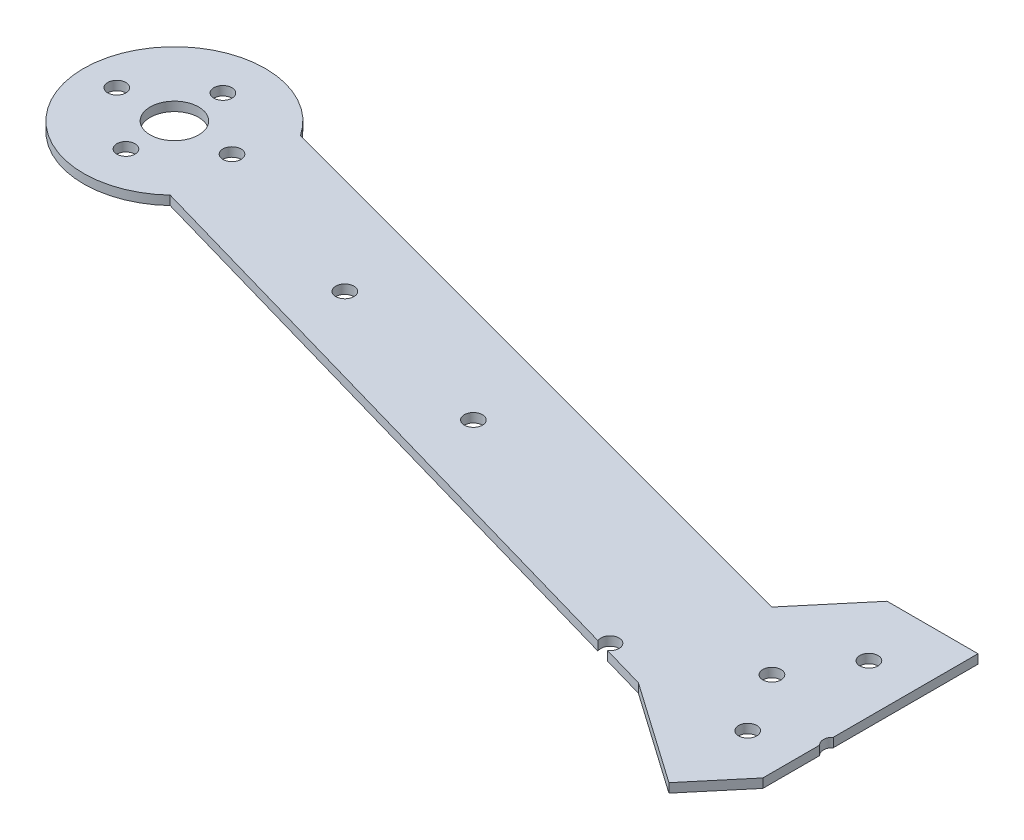
ISO-10303-21;
HEADER;
FILE_DESCRIPTION(('STEP AP214'),'2;1');
FILE_NAME('part.step','',(''),(''),'','','');
FILE_SCHEMA(('AUTOMOTIVE_DESIGN { 1 0 10303 214 1 1 1 1 }'));
ENDSEC;
DATA;
#1=APPLICATION_CONTEXT('core data for automotive mechanical design processes');
#2=APPLICATION_PROTOCOL_DEFINITION('international standard','automotive_design',2000,#1);
#3=PRODUCT_CONTEXT('',#1,'mechanical');
#4=PRODUCT('Part','Part','',(#3));
#5=PRODUCT_RELATED_PRODUCT_CATEGORY('part','',(#4));
#6=PRODUCT_DEFINITION_FORMATION('','',#4);
#7=PRODUCT_DEFINITION_CONTEXT('part definition',#1,'design');
#8=PRODUCT_DEFINITION('design','',#6,#7);
#9=PRODUCT_DEFINITION_SHAPE('','',#8);
#10=(LENGTH_UNIT() NAMED_UNIT(*) SI_UNIT(.MILLI.,.METRE.));
#11=(NAMED_UNIT(*) PLANE_ANGLE_UNIT() SI_UNIT($,.RADIAN.));
#12=(NAMED_UNIT(*) SI_UNIT($,.STERADIAN.) SOLID_ANGLE_UNIT());
#13=UNCERTAINTY_MEASURE_WITH_UNIT(LENGTH_MEASURE(1.E-05),#10,'distance_accuracy_value','');
#14=(GEOMETRIC_REPRESENTATION_CONTEXT(3) GLOBAL_UNCERTAINTY_ASSIGNED_CONTEXT((#13)) GLOBAL_UNIT_ASSIGNED_CONTEXT((#10,
#11,#12)) REPRESENTATION_CONTEXT('',''));
#15=CARTESIAN_POINT('',(0.,0.,0.));
#16=DIRECTION('',(0.,0.,1.));
#17=DIRECTION('',(1.,0.,0.));
#18=AXIS2_PLACEMENT_3D('',#15,#16,#17);
#19=CARTESIAN_POINT('',(1.,1.5,-10.5));
#20=DIRECTION('',(0.,-1.,0.));
#21=DIRECTION('',(0.,0.,-1.));
#22=AXIS2_PLACEMENT_3D('',#19,#20,#21);
#23=CYLINDRICAL_SURFACE('',#22,1.5);
#24=CARTESIAN_POINT('',(1.,0.,-10.5));
#25=DIRECTION('',(0.,1.,0.));
#26=DIRECTION('',(0.,0.,1.));
#27=AXIS2_PLACEMENT_3D('',#24,#25,#26);
#28=CIRCLE('',#27,1.5);
#29=CARTESIAN_POINT('',(0.,0.,-11.6180339887499));
#30=VERTEX_POINT('',#29);
#31=CARTESIAN_POINT('',(0.,0.,-9.3819660112501));
#32=VERTEX_POINT('',#31);
#33=EDGE_CURVE('E209',#30,#32,#28,.T.);
#34=ORIENTED_EDGE('',*,*,#33,.F.);
#35=DIRECTION('',(0.,-1.,0.));
#36=VECTOR('',#35,1.);
#37=CARTESIAN_POINT('',(0.,1.5,-11.6180339887499));
#38=LINE('',#37,#36);
#39=CARTESIAN_POINT('',(0.,1.5,-11.6180339887499));
#40=VERTEX_POINT('',#39);
#41=EDGE_CURVE('E11',#40,#30,#38,.T.);
#42=ORIENTED_EDGE('',*,*,#41,.F.);
#43=CARTESIAN_POINT('',(1.,1.5,-10.5));
#44=DIRECTION('',(0.,1.,0.));
#45=DIRECTION('',(0.,0.,1.));
#46=AXIS2_PLACEMENT_3D('',#43,#44,#45);
#47=CIRCLE('',#46,1.5);
#48=CARTESIAN_POINT('',(0.,1.5,-9.3819660112501));
#49=VERTEX_POINT('',#48);
#50=EDGE_CURVE('E465',#40,#49,#47,.T.);
#51=ORIENTED_EDGE('',*,*,#50,.T.);
#52=DIRECTION('',(0.,-1.,0.));
#53=VECTOR('',#52,1.);
#54=CARTESIAN_POINT('',(0.,1.5,-9.3819660112501));
#55=LINE('',#54,#53);
#56=EDGE_CURVE('E107',#49,#32,#55,.T.);
#57=ORIENTED_EDGE('',*,*,#56,.T.);
#58=EDGE_LOOP('',(#34,#42,#51,#57));
#59=FACE_BOUND('',#58,.T.);
#60=ADVANCED_FACE('F43',(#59),#23,.F.);
#61=CARTESIAN_POINT('',(0.,1.5,0.));
#62=DIRECTION('',(-1.,0.,0.));
#63=DIRECTION('',(0.,0.,1.));
#64=AXIS2_PLACEMENT_3D('',#61,#62,#63);
#65=PLANE('',#64);
#66=DIRECTION('',(0.,0.,-1.));
#67=VECTOR('',#66,1.);
#68=CARTESIAN_POINT('',(0.,0.,0.));
#69=LINE('',#68,#67);
#70=CARTESIAN_POINT('',(0.,0.,-35.5));
#71=VERTEX_POINT('',#70);
#72=EDGE_CURVE('E213',#30,#71,#69,.T.);
#73=ORIENTED_EDGE('',*,*,#72,.T.);
#74=DIRECTION('',(0.,-1.,0.));
#75=VECTOR('',#74,1.);
#76=CARTESIAN_POINT('',(0.,1.5,-35.5));
#77=LINE('',#76,#75);
#78=CARTESIAN_POINT('',(0.,1.5,-35.5));
#79=VERTEX_POINT('',#78);
#80=EDGE_CURVE('E53',#79,#71,#77,.T.);
#81=ORIENTED_EDGE('',*,*,#80,.F.);
#82=DIRECTION('',(0.,0.,-1.));
#83=VECTOR('',#82,1.);
#84=CARTESIAN_POINT('',(0.,1.5,0.));
#85=LINE('',#84,#83);
#86=EDGE_CURVE('E167',#40,#79,#85,.T.);
#87=ORIENTED_EDGE('',*,*,#86,.F.);
#88=ORIENTED_EDGE('',*,*,#41,.T.);
#89=EDGE_LOOP('',(#73,#81,#87,#88));
#90=FACE_BOUND('',#89,.T.);
#91=ADVANCED_FACE('F301',(#90),#65,.F.);
#92=CARTESIAN_POINT('',(0.,1.5,-35.5));
#93=DIRECTION('',(0.,0.,1.));
#94=DIRECTION('',(1.,0.,0.));
#95=AXIS2_PLACEMENT_3D('',#92,#93,#94);
#96=PLANE('',#95);
#97=DIRECTION('',(-1.,0.,0.));
#98=VECTOR('',#97,1.);
#99=CARTESIAN_POINT('',(0.,0.,-35.5));
#100=LINE('',#99,#98);
#101=CARTESIAN_POINT('',(-15.,0.,-35.5));
#102=VERTEX_POINT('',#101);
#103=EDGE_CURVE('E217',#71,#102,#100,.T.);
#104=ORIENTED_EDGE('',*,*,#103,.T.);
#105=DIRECTION('',(0.,-1.,0.));
#106=VECTOR('',#105,1.);
#107=CARTESIAN_POINT('',(-15.,1.5,-35.5));
#108=LINE('',#107,#106);
#109=CARTESIAN_POINT('',(-15.,1.5,-35.5));
#110=VERTEX_POINT('',#109);
#111=EDGE_CURVE('E287',#110,#102,#108,.T.);
#112=ORIENTED_EDGE('',*,*,#111,.F.);
#113=DIRECTION('',(-1.,0.,0.));
#114=VECTOR('',#113,1.);
#115=CARTESIAN_POINT('',(0.,1.5,-35.5));
#116=LINE('',#115,#114);
#117=EDGE_CURVE('E297',#79,#110,#116,.T.);
#118=ORIENTED_EDGE('',*,*,#117,.F.);
#119=ORIENTED_EDGE('',*,*,#80,.T.);
#120=EDGE_LOOP('',(#104,#112,#118,#119));
#121=FACE_BOUND('',#120,.T.);
#122=ADVANCED_FACE('F294',(#121),#96,.F.);
#123=CARTESIAN_POINT('',(-26.2826989484687,1.5,-22.0538029940034));
#124=DIRECTION('',(0.76604444311898,0.,0.642787609686537));
#125=DIRECTION('',(0.642787609686537,0.,-0.76604444311898));
#126=AXIS2_PLACEMENT_3D('',#123,#124,#125);
#127=PLANE('',#126);
#128=DIRECTION('',(-0.642787609686537,0.,0.76604444311898));
#129=VECTOR('',#128,1.);
#130=CARTESIAN_POINT('',(-26.2826989484687,0.,-22.0538029940034));
#131=LINE('',#130,#129);
#132=CARTESIAN_POINT('',(-23.6776327307683,0.,-25.1584000178938));
#133=VERTEX_POINT('',#132);
#134=EDGE_CURVE('E222',#102,#133,#131,.T.);
#135=ORIENTED_EDGE('',*,*,#134,.T.);
#136=DIRECTION('',(0.,-1.,0.));
#137=VECTOR('',#136,1.);
#138=CARTESIAN_POINT('',(-23.6776327307683,1.5,-25.1584000178938));
#139=LINE('',#138,#137);
#140=CARTESIAN_POINT('',(-23.6776327307683,1.5,-25.1584000178938));
#141=VERTEX_POINT('',#140);
#142=EDGE_CURVE('E283',#141,#133,#139,.T.);
#143=ORIENTED_EDGE('',*,*,#142,.F.);
#144=DIRECTION('',(-0.642787609686537,0.,0.76604444311898));
#145=VECTOR('',#144,1.);
#146=CARTESIAN_POINT('',(-26.2826989484687,1.5,-22.0538029940034));
#147=LINE('',#146,#145);
#148=EDGE_CURVE('E420',#110,#141,#147,.T.);
#149=ORIENTED_EDGE('',*,*,#148,.F.);
#150=ORIENTED_EDGE('',*,*,#111,.T.);
#151=EDGE_LOOP('',(#135,#143,#149,#150));
#152=FACE_BOUND('',#151,.T.);
#153=ADVANCED_FACE('F406',(#152),#127,.F.);
#154=CARTESIAN_POINT('',(4.70349936225092,1.5,-17.5536985932883));
#155=DIRECTION('',(-0.258819045102521,0.,0.965925826289068));
#156=DIRECTION('',(0.965925826289068,0.,0.258819045102521));
#157=AXIS2_PLACEMENT_3D('',#154,#155,#156);
#158=PLANE('',#157);
#159=DIRECTION('',(-0.965925826289068,0.,-0.258819045102521));
#160=VECTOR('',#159,1.);
#161=CARTESIAN_POINT('',(4.70349936225092,0.,-17.5536985932883));
#162=LINE('',#161,#160);
#163=CARTESIAN_POINT('',(-129.929473622566,0.,-53.628494979171));
#164=VERTEX_POINT('',#163);
#165=EDGE_CURVE('E226',#133,#164,#162,.T.);
#166=ORIENTED_EDGE('',*,*,#165,.T.);
#167=DIRECTION('',(0.,-1.,0.));
#168=VECTOR('',#167,1.);
#169=CARTESIAN_POINT('',(-129.929473622566,1.5,-53.628494979171));
#170=LINE('',#169,#168);
#171=CARTESIAN_POINT('',(-129.929473622566,1.5,-53.628494979171));
#172=VERTEX_POINT('',#171);
#173=EDGE_CURVE('E279',#172,#164,#170,.T.);
#174=ORIENTED_EDGE('',*,*,#173,.F.);
#175=DIRECTION('',(-0.965925826289068,0.,-0.258819045102521));
#176=VECTOR('',#175,1.);
#177=CARTESIAN_POINT('',(4.70349936225092,1.5,-17.5536985932883));
#178=LINE('',#177,#176);
#179=EDGE_CURVE('E416',#141,#172,#178,.T.);
#180=ORIENTED_EDGE('',*,*,#179,.F.);
#181=ORIENTED_EDGE('',*,*,#142,.T.);
#182=EDGE_LOOP('',(#166,#174,#180,#181));
#183=FACE_BOUND('',#182,.T.);
#184=ADVANCED_FACE('F403',(#183),#158,.F.);
#185=CARTESIAN_POINT('',(-142.429473622566,1.5,-45.3369330032825));
#186=DIRECTION('',(0.,-1.,0.));
#187=DIRECTION('',(0.,0.,-1.));
#188=AXIS2_PLACEMENT_3D('',#185,#186,#187);
#189=CYLINDRICAL_SURFACE('',#188,15.);
#190=CARTESIAN_POINT('',(-142.429473622566,0.,-45.3369330032825));
#191=DIRECTION('',(0.,1.,0.));
#192=DIRECTION('',(0.,0.,1.));
#193=AXIS2_PLACEMENT_3D('',#190,#191,#192);
#194=CIRCLE('',#193,15.);
#195=CARTESIAN_POINT('',(-132.179322969664,0.,-34.3854759498666));
#196=VERTEX_POINT('',#195);
#197=EDGE_CURVE('E230',#164,#196,#194,.T.);
#198=ORIENTED_EDGE('',*,*,#197,.T.);
#199=DIRECTION('',(0.,-1.,0.));
#200=VECTOR('',#199,1.);
#201=CARTESIAN_POINT('',(-132.179322969664,1.5,-34.3854759498666));
#202=LINE('',#201,#200);
#203=CARTESIAN_POINT('',(-132.179322969664,1.5,-34.3854759498666));
#204=VERTEX_POINT('',#203);
#205=EDGE_CURVE('E276',#204,#196,#202,.T.);
#206=ORIENTED_EDGE('',*,*,#205,.F.);
#207=CARTESIAN_POINT('',(-142.429473622566,1.5,-45.3369330032825));
#208=DIRECTION('',(0.,1.,0.));
#209=DIRECTION('',(0.,0.,1.));
#210=AXIS2_PLACEMENT_3D('',#207,#208,#209);
#211=CIRCLE('',#210,15.);
#212=EDGE_CURVE('E419',#172,#204,#211,.T.);
#213=ORIENTED_EDGE('',*,*,#212,.F.);
#214=ORIENTED_EDGE('',*,*,#173,.T.);
#215=EDGE_LOOP('',(#198,#206,#213,#214));
#216=FACE_BOUND('',#215,.T.);
#217=ADVANCED_FACE('F399',(#216),#189,.T.);
#218=CARTESIAN_POINT('',(-0.929776697849791,1.5,3.24308862448773));
#219=DIRECTION('',(-0.275592437769967,0.,0.961274574845297));
#220=DIRECTION('',(0.961274574845297,0.,0.275592437769967));
#221=AXIS2_PLACEMENT_3D('',#218,#219,#220);
#222=PLANE('',#221);
#223=DIRECTION('',(-0.961274574845297,0.,-0.275592437769967));
#224=VECTOR('',#223,1.);
#225=CARTESIAN_POINT('',(-0.929776697849791,0.,3.24308862448773));
#226=LINE('',#225,#224);
#227=CARTESIAN_POINT('',(-33.2237894230508,0.,-6.01543742541306));
#228=VERTEX_POINT('',#227);
#229=EDGE_CURVE('E234',#228,#196,#226,.T.);
#230=ORIENTED_EDGE('',*,*,#229,.F.);
#231=DIRECTION('',(0.,-1.,0.));
#232=VECTOR('',#231,1.);
#233=CARTESIAN_POINT('',(-33.2237894230508,1.5,-6.01543742541306));
#234=LINE('',#233,#232);
#235=CARTESIAN_POINT('',(-33.2237894230508,1.5,-6.01543742541306));
#236=VERTEX_POINT('',#235);
#237=EDGE_CURVE('E273',#236,#228,#234,.T.);
#238=ORIENTED_EDGE('',*,*,#237,.F.);
#239=DIRECTION('',(-0.961274574845297,0.,-0.275592437769967));
#240=VECTOR('',#239,1.);
#241=CARTESIAN_POINT('',(-0.929776697849791,1.5,3.24308862448773));
#242=LINE('',#241,#240);
#243=EDGE_CURVE('E429',#236,#204,#242,.T.);
#244=ORIENTED_EDGE('',*,*,#243,.T.);
#245=ORIENTED_EDGE('',*,*,#205,.T.);
#246=EDGE_LOOP('',(#230,#238,#244,#245));
#247=FACE_BOUND('',#246,.T.);
#248=ADVANCED_FACE('F395',(#247),#222,.T.);
#249=CARTESIAN_POINT('',(-31.86,1.5,-6.64));
#250=DIRECTION('',(0.,-1.,0.));
#251=DIRECTION('',(0.,0.,-1.));
#252=AXIS2_PLACEMENT_3D('',#249,#250,#251);
#253=CYLINDRICAL_SURFACE('',#252,1.5);
#254=CARTESIAN_POINT('',(-31.86,0.,-6.64));
#255=DIRECTION('',(0.,1.,0.));
#256=DIRECTION('',(0.,0.,1.));
#257=AXIS2_PLACEMENT_3D('',#254,#255,#256);
#258=CIRCLE('',#257,1.5);
#259=CARTESIAN_POINT('',(-31.034291679745,0.,-5.38771977183151));
#260=VERTEX_POINT('',#259);
#261=EDGE_CURVE('E238',#260,#228,#258,.T.);
#262=ORIENTED_EDGE('',*,*,#261,.F.);
#263=DIRECTION('',(0.,-1.,0.));
#264=VECTOR('',#263,1.);
#265=CARTESIAN_POINT('',(-31.034291679745,1.5,-5.38771977183151));
#266=LINE('',#265,#264);
#267=CARTESIAN_POINT('',(-31.034291679745,1.5,-5.38771977183151));
#268=VERTEX_POINT('',#267);
#269=EDGE_CURVE('E270',#268,#260,#266,.T.);
#270=ORIENTED_EDGE('',*,*,#269,.F.);
#271=CARTESIAN_POINT('',(-31.86,1.5,-6.64));
#272=DIRECTION('',(0.,1.,0.));
#273=DIRECTION('',(0.,0.,1.));
#274=AXIS2_PLACEMENT_3D('',#271,#272,#273);
#275=CIRCLE('',#274,1.5);
#276=EDGE_CURVE('E433',#268,#236,#275,.T.);
#277=ORIENTED_EDGE('',*,*,#276,.T.);
#278=ORIENTED_EDGE('',*,*,#237,.T.);
#279=EDGE_LOOP('',(#262,#270,#277,#278));
#280=FACE_BOUND('',#279,.T.);
#281=ADVANCED_FACE('F391',(#280),#253,.F.);
#282=CARTESIAN_POINT('',(-0.929776697849788,1.5,3.24308862448772));
#283=DIRECTION('',(-0.275592437769967,0.,0.961274574845297));
#284=DIRECTION('',(0.961274574845297,0.,0.275592437769967));
#285=AXIS2_PLACEMENT_3D('',#282,#283,#284);
#286=PLANE('',#285);
#287=DIRECTION('',(-0.961274574845297,0.,-0.275592437769967));
#288=VECTOR('',#287,1.);
#289=CARTESIAN_POINT('',(-0.929776697849788,0.,3.24308862448772));
#290=LINE('',#289,#288);
#291=CARTESIAN_POINT('',(-23.8632806144762,0.,-3.3318280708876));
#292=VERTEX_POINT('',#291);
#293=EDGE_CURVE('E242',#292,#260,#290,.T.);
#294=ORIENTED_EDGE('',*,*,#293,.F.);
#295=DIRECTION('',(0.,-1.,0.));
#296=VECTOR('',#295,1.);
#297=CARTESIAN_POINT('',(-23.8632806144762,1.5,-3.3318280708876));
#298=LINE('',#297,#296);
#299=CARTESIAN_POINT('',(-23.8632806144762,1.5,-3.3318280708876));
#300=VERTEX_POINT('',#299);
#301=EDGE_CURVE('E150',#300,#292,#298,.T.);
#302=ORIENTED_EDGE('',*,*,#301,.F.);
#303=DIRECTION('',(-0.961274574845297,0.,-0.275592437769967));
#304=VECTOR('',#303,1.);
#305=CARTESIAN_POINT('',(-0.929776697849788,1.5,3.24308862448772));
#306=LINE('',#305,#304);
#307=EDGE_CURVE('E158',#300,#268,#306,.T.);
#308=ORIENTED_EDGE('',*,*,#307,.T.);
#309=ORIENTED_EDGE('',*,*,#269,.T.);
#310=EDGE_LOOP('',(#294,#302,#308,#309));
#311=FACE_BOUND('',#310,.T.);
#312=ADVANCED_FACE('F388',(#311),#286,.T.);
#313=CARTESIAN_POINT('',(-6.28533185327594,1.5,8.97638415796881));
#314=DIRECTION('',(-0.573576436351044,0.,0.819152044288993));
#315=DIRECTION('',(0.819152044288993,0.,0.573576436351044));
#316=AXIS2_PLACEMENT_3D('',#313,#314,#315);
#317=PLANE('',#316);
#318=DIRECTION('',(-0.819152044288993,0.,-0.573576436351044));
#319=VECTOR('',#318,1.);
#320=CARTESIAN_POINT('',(-6.28533185327594,0.,8.97638415796881));
#321=LINE('',#320,#319);
#322=CARTESIAN_POINT('',(-7.07066370655188,0.,8.4264888743088));
#323=VERTEX_POINT('',#322);
#324=EDGE_CURVE('E144',#323,#292,#321,.T.);
#325=ORIENTED_EDGE('',*,*,#324,.F.);
#326=DIRECTION('',(0.,-1.,0.));
#327=VECTOR('',#326,1.);
#328=CARTESIAN_POINT('',(-7.07066370655188,1.5,8.4264888743088));
#329=LINE('',#328,#327);
#330=CARTESIAN_POINT('',(-7.07066370655188,1.5,8.4264888743088));
#331=VERTEX_POINT('',#330);
#332=EDGE_CURVE('E139',#331,#323,#329,.T.);
#333=ORIENTED_EDGE('',*,*,#332,.F.);
#334=DIRECTION('',(-0.819152044288993,0.,-0.573576436351044));
#335=VECTOR('',#334,1.);
#336=CARTESIAN_POINT('',(-6.28533185327594,1.5,8.97638415796881));
#337=LINE('',#336,#335);
#338=EDGE_CURVE('E142',#331,#300,#337,.T.);
#339=ORIENTED_EDGE('',*,*,#338,.T.);
#340=ORIENTED_EDGE('',*,*,#301,.T.);
#341=EDGE_LOOP('',(#325,#333,#339,#340));
#342=FACE_BOUND('',#341,.T.);
#343=ADVANCED_FACE('F141',(#342),#317,.T.);
#344=CARTESIAN_POINT('',(0.,1.5,0.));
#345=DIRECTION('',(0.766044443118982,0.,0.642787609686535));
#346=DIRECTION('',(0.642787609686535,0.,-0.766044443118982));
#347=AXIS2_PLACEMENT_3D('',#344,#345,#346);
#348=PLANE('',#347);
#349=DIRECTION('',(-0.642787609686535,0.,0.766044443118982));
#350=VECTOR('',#349,1.);
#351=CARTESIAN_POINT('',(0.,0.,0.));
#352=LINE('',#351,#350);
#353=CARTESIAN_POINT('',(0.,0.,0.));
#354=VERTEX_POINT('',#353);
#355=EDGE_CURVE('E248',#354,#323,#352,.T.);
#356=ORIENTED_EDGE('',*,*,#355,.F.);
#357=DIRECTION('',(0.,-1.,0.));
#358=VECTOR('',#357,1.);
#359=CARTESIAN_POINT('',(0.,1.5,0.));
#360=LINE('',#359,#358);
#361=CARTESIAN_POINT('',(0.,1.5,0.));
#362=VERTEX_POINT('',#361);
#363=EDGE_CURVE('E100',#362,#354,#360,.T.);
#364=ORIENTED_EDGE('',*,*,#363,.F.);
#365=DIRECTION('',(-0.642787609686535,0.,0.766044443118982));
#366=VECTOR('',#365,1.);
#367=CARTESIAN_POINT('',(0.,1.5,0.));
#368=LINE('',#367,#366);
#369=EDGE_CURVE('E155',#362,#331,#368,.T.);
#370=ORIENTED_EDGE('',*,*,#369,.T.);
#371=ORIENTED_EDGE('',*,*,#332,.T.);
#372=EDGE_LOOP('',(#356,#364,#370,#371));
#373=FACE_BOUND('',#372,.T.);
#374=ADVANCED_FACE('F161',(#373),#348,.T.);
#375=CARTESIAN_POINT('',(-14.,1.5,-15.5));
#376=DIRECTION('',(0.,-1.,0.));
#377=DIRECTION('',(0.,0.,-1.));
#378=AXIS2_PLACEMENT_3D('',#375,#376,#377);
#379=CYLINDRICAL_SURFACE('',#378,1.5);
#380=CARTESIAN_POINT('',(-14.,1.5,-15.5));
#381=DIRECTION('',(0.,1.,0.));
#382=DIRECTION('',(0.,0.,1.));
#383=AXIS2_PLACEMENT_3D('',#380,#381,#382);
#384=CIRCLE('',#383,1.5);
#385=CARTESIAN_POINT('',(-14.,1.5,-14.));
#386=VERTEX_POINT('',#385);
#387=EDGE_CURVE('E173',#386,#386,#384,.T.);
#388=ORIENTED_EDGE('',*,*,#387,.T.);
#389=EDGE_LOOP('',(#388));
#390=FACE_BOUND('',#389,.T.);
#391=CARTESIAN_POINT('',(-14.,0.,-15.5));
#392=DIRECTION('',(0.,1.,0.));
#393=DIRECTION('',(0.,0.,1.));
#394=AXIS2_PLACEMENT_3D('',#391,#392,#393);
#395=CIRCLE('',#394,1.5);
#396=CARTESIAN_POINT('',(-14.,0.,-14.));
#397=VERTEX_POINT('',#396);
#398=EDGE_CURVE('E255',#397,#397,#395,.T.);
#399=ORIENTED_EDGE('',*,*,#398,.F.);
#400=EDGE_LOOP('',(#399));
#401=FACE_BOUND('',#400,.T.);
#402=ADVANCED_FACE('F375',(#390,#401),#379,.F.);
#403=CARTESIAN_POINT('',(-8.,1.5,-5.5));
#404=DIRECTION('',(0.,-1.,0.));
#405=DIRECTION('',(0.,0.,-1.));
#406=AXIS2_PLACEMENT_3D('',#403,#404,#405);
#407=CYLINDRICAL_SURFACE('',#406,1.5);
#408=CARTESIAN_POINT('',(-8.,1.5,-5.5));
#409=DIRECTION('',(0.,1.,0.));
#410=DIRECTION('',(0.,0.,1.));
#411=AXIS2_PLACEMENT_3D('',#408,#409,#410);
#412=CIRCLE('',#411,1.5);
#413=CARTESIAN_POINT('',(-8.,1.5,-4.));
#414=VERTEX_POINT('',#413);
#415=EDGE_CURVE('E165',#414,#414,#412,.T.);
#416=ORIENTED_EDGE('',*,*,#415,.T.);
#417=EDGE_LOOP('',(#416));
#418=FACE_BOUND('',#417,.T.);
#419=CARTESIAN_POINT('',(-8.,0.,-5.5));
#420=DIRECTION('',(0.,1.,0.));
#421=DIRECTION('',(0.,0.,1.));
#422=AXIS2_PLACEMENT_3D('',#419,#420,#421);
#423=CIRCLE('',#422,1.5);
#424=CARTESIAN_POINT('',(-8.,0.,-4.));
#425=VERTEX_POINT('',#424);
#426=EDGE_CURVE('E251',#425,#425,#423,.T.);
#427=ORIENTED_EDGE('',*,*,#426,.F.);
#428=EDGE_LOOP('',(#427));
#429=FACE_BOUND('',#428,.T.);
#430=ADVANCED_FACE('F378',(#418,#429),#407,.F.);
#431=EDGE_CURVE('E218',#354,#32,#69,.T.);
#432=ORIENTED_EDGE('',*,*,#431,.T.);
#433=ORIENTED_EDGE('',*,*,#56,.F.);
#434=EDGE_CURVE('E61',#362,#49,#85,.T.);
#435=ORIENTED_EDGE('',*,*,#434,.F.);
#436=ORIENTED_EDGE('',*,*,#363,.T.);
#437=EDGE_LOOP('',(#432,#433,#435,#436));
#438=FACE_BOUND('',#437,.T.);
#439=ADVANCED_FACE('F311',(#438),#65,.F.);
#440=CARTESIAN_POINT('',(-142.429473622566,1.5,-45.3369330032825));
#441=DIRECTION('',(0.,-1.,0.));
#442=DIRECTION('',(0.,0.,-1.));
#443=AXIS2_PLACEMENT_3D('',#440,#441,#442);
#444=CYLINDRICAL_SURFACE('',#443,4.);
#445=CARTESIAN_POINT('',(-142.429473622566,1.5,-45.3369330032825));
#446=DIRECTION('',(0.,1.,0.));
#447=DIRECTION('',(0.,0.,1.));
#448=AXIS2_PLACEMENT_3D('',#445,#446,#447);
#449=CIRCLE('',#448,4.);
#450=CARTESIAN_POINT('',(-142.429473622566,1.5,-41.3369330032825));
#451=VERTEX_POINT('',#450);
#452=EDGE_CURVE('E461',#451,#451,#449,.T.);
#453=ORIENTED_EDGE('',*,*,#452,.T.);
#454=EDGE_LOOP('',(#453));
#455=FACE_BOUND('',#454,.T.);
#456=CARTESIAN_POINT('',(-142.429473622566,0.,-45.3369330032825));
#457=DIRECTION('',(0.,1.,0.));
#458=DIRECTION('',(0.,0.,1.));
#459=AXIS2_PLACEMENT_3D('',#456,#457,#458);
#460=CIRCLE('',#459,4.);
#461=CARTESIAN_POINT('',(-142.429473622566,0.,-41.3369330032825));
#462=VERTEX_POINT('',#461);
#463=EDGE_CURVE('E205',#462,#462,#460,.T.);
#464=ORIENTED_EDGE('',*,*,#463,.F.);
#465=EDGE_LOOP('',(#464));
#466=FACE_BOUND('',#465,.T.);
#467=ADVANCED_FACE('F315',(#455,#466),#444,.F.);
#468=CARTESIAN_POINT('',(-104.01460351105,1.5,-35.0436995795553));
#469=DIRECTION('',(0.,-1.,0.));
#470=DIRECTION('',(0.,0.,-1.));
#471=AXIS2_PLACEMENT_3D('',#468,#469,#470);
#472=CYLINDRICAL_SURFACE('',#471,1.5);
#473=CARTESIAN_POINT('',(-104.01460351105,1.5,-35.0436995795553));
#474=DIRECTION('',(0.,1.,0.));
#475=DIRECTION('',(0.,0.,1.));
#476=AXIS2_PLACEMENT_3D('',#473,#474,#475);
#477=CIRCLE('',#476,1.5);
#478=CARTESIAN_POINT('',(-104.01460351105,1.5,-33.5436995795553));
#479=VERTEX_POINT('',#478);
#480=EDGE_CURVE('E457',#479,#479,#477,.T.);
#481=ORIENTED_EDGE('',*,*,#480,.T.);
#482=EDGE_LOOP('',(#481));
#483=FACE_BOUND('',#482,.T.);
#484=CARTESIAN_POINT('',(-104.01460351105,0.,-35.0436995795553));
#485=DIRECTION('',(0.,1.,0.));
#486=DIRECTION('',(0.,0.,1.));
#487=AXIS2_PLACEMENT_3D('',#484,#485,#486);
#488=CIRCLE('',#487,1.5);
#489=CARTESIAN_POINT('',(-104.01460351105,0.,-33.5436995795553));
#490=VERTEX_POINT('',#489);
#491=EDGE_CURVE('E201',#490,#490,#488,.T.);
#492=ORIENTED_EDGE('',*,*,#491,.F.);
#493=EDGE_LOOP('',(#492));
#494=FACE_BOUND('',#493,.T.);
#495=ADVANCED_FACE('F318',(#483,#494),#472,.F.);
#496=CARTESIAN_POINT('',(-75.0368287223775,1.5,-27.2791282264797));
#497=DIRECTION('',(0.,-1.,0.));
#498=DIRECTION('',(0.,0.,-1.));
#499=AXIS2_PLACEMENT_3D('',#496,#497,#498);
#500=CYLINDRICAL_SURFACE('',#499,1.5);
#501=CARTESIAN_POINT('',(-75.0368287223775,1.5,-27.2791282264797));
#502=DIRECTION('',(0.,1.,0.));
#503=DIRECTION('',(0.,0.,1.));
#504=AXIS2_PLACEMENT_3D('',#501,#502,#503);
#505=CIRCLE('',#504,1.5);
#506=CARTESIAN_POINT('',(-75.0368287223775,1.5,-25.7791282264797));
#507=VERTEX_POINT('',#506);
#508=EDGE_CURVE('E453',#507,#507,#505,.T.);
#509=ORIENTED_EDGE('',*,*,#508,.T.);
#510=EDGE_LOOP('',(#509));
#511=FACE_BOUND('',#510,.T.);
#512=CARTESIAN_POINT('',(-75.0368287223775,0.,-27.2791282264797));
#513=DIRECTION('',(0.,1.,0.));
#514=DIRECTION('',(0.,0.,1.));
#515=AXIS2_PLACEMENT_3D('',#512,#513,#514);
#516=CIRCLE('',#515,1.5);
#517=CARTESIAN_POINT('',(-75.0368287223775,0.,-25.7791282264797));
#518=VERTEX_POINT('',#517);
#519=EDGE_CURVE('E197',#518,#518,#516,.T.);
#520=ORIENTED_EDGE('',*,*,#519,.F.);
#521=EDGE_LOOP('',(#520));
#522=FACE_BOUND('',#521,.T.);
#523=ADVANCED_FACE('F322',(#511,#522),#500,.F.);
#524=CARTESIAN_POINT('',(-142.429473622566,1.5,-53.3369330032825));
#525=DIRECTION('',(0.,-1.,0.));
#526=DIRECTION('',(0.,0.,-1.));
#527=AXIS2_PLACEMENT_3D('',#524,#525,#526);
#528=CYLINDRICAL_SURFACE('',#527,1.5);
#529=CARTESIAN_POINT('',(-142.429473622566,1.5,-53.3369330032825));
#530=DIRECTION('',(0.,1.,0.));
#531=DIRECTION('',(0.,0.,1.));
#532=AXIS2_PLACEMENT_3D('',#529,#530,#531);
#533=CIRCLE('',#532,1.5);
#534=CARTESIAN_POINT('',(-142.429473622566,1.5,-51.8369330032825));
#535=VERTEX_POINT('',#534);
#536=EDGE_CURVE('E449',#535,#535,#533,.T.);
#537=ORIENTED_EDGE('',*,*,#536,.T.);
#538=EDGE_LOOP('',(#537));
#539=FACE_BOUND('',#538,.T.);
#540=CARTESIAN_POINT('',(-142.429473622566,0.,-53.3369330032825));
#541=DIRECTION('',(0.,1.,0.));
#542=DIRECTION('',(0.,0.,1.));
#543=AXIS2_PLACEMENT_3D('',#540,#541,#542);
#544=CIRCLE('',#543,1.5);
#545=CARTESIAN_POINT('',(-142.429473622566,0.,-51.8369330032825));
#546=VERTEX_POINT('',#545);
#547=EDGE_CURVE('E193',#546,#546,#544,.T.);
#548=ORIENTED_EDGE('',*,*,#547,.F.);
#549=EDGE_LOOP('',(#548));
#550=FACE_BOUND('',#549,.T.);
#551=ADVANCED_FACE('F326',(#539,#550),#528,.F.);
#552=CARTESIAN_POINT('',(-142.429473622566,1.5,-37.3369330032825));
#553=DIRECTION('',(0.,-1.,0.));
#554=DIRECTION('',(0.,0.,-1.));
#555=AXIS2_PLACEMENT_3D('',#552,#553,#554);
#556=CYLINDRICAL_SURFACE('',#555,1.5);
#557=CARTESIAN_POINT('',(-142.429473622566,1.5,-37.3369330032825));
#558=DIRECTION('',(0.,1.,0.));
#559=DIRECTION('',(0.,0.,1.));
#560=AXIS2_PLACEMENT_3D('',#557,#558,#559);
#561=CIRCLE('',#560,1.5);
#562=CARTESIAN_POINT('',(-142.429473622566,1.5,-35.8369330032825));
#563=VERTEX_POINT('',#562);
#564=EDGE_CURVE('E445',#563,#563,#561,.T.);
#565=ORIENTED_EDGE('',*,*,#564,.T.);
#566=EDGE_LOOP('',(#565));
#567=FACE_BOUND('',#566,.T.);
#568=CARTESIAN_POINT('',(-142.429473622566,0.,-37.3369330032825));
#569=DIRECTION('',(0.,1.,0.));
#570=DIRECTION('',(0.,0.,1.));
#571=AXIS2_PLACEMENT_3D('',#568,#569,#570);
#572=CIRCLE('',#571,1.5);
#573=CARTESIAN_POINT('',(-142.429473622566,0.,-35.8369330032825));
#574=VERTEX_POINT('',#573);
#575=EDGE_CURVE('E189',#574,#574,#572,.T.);
#576=ORIENTED_EDGE('',*,*,#575,.F.);
#577=EDGE_LOOP('',(#576));
#578=FACE_BOUND('',#577,.T.);
#579=ADVANCED_FACE('F330',(#567,#578),#556,.F.);
#580=CARTESIAN_POINT('',(-151.929473622566,1.5,-45.3369330032826));
#581=DIRECTION('',(0.,-1.,0.));
#582=DIRECTION('',(0.,0.,-1.));
#583=AXIS2_PLACEMENT_3D('',#580,#581,#582);
#584=CYLINDRICAL_SURFACE('',#583,1.5);
#585=CARTESIAN_POINT('',(-151.929473622566,1.5,-45.3369330032826));
#586=DIRECTION('',(0.,1.,0.));
#587=DIRECTION('',(0.,0.,1.));
#588=AXIS2_PLACEMENT_3D('',#585,#586,#587);
#589=CIRCLE('',#588,1.5);
#590=CARTESIAN_POINT('',(-151.929473622566,1.5,-43.8369330032826));
#591=VERTEX_POINT('',#590);
#592=EDGE_CURVE('E345',#591,#591,#589,.T.);
#593=ORIENTED_EDGE('',*,*,#592,.T.);
#594=EDGE_LOOP('',(#593));
#595=FACE_BOUND('',#594,.T.);
#596=CARTESIAN_POINT('',(-151.929473622566,0.,-45.3369330032826));
#597=DIRECTION('',(0.,1.,0.));
#598=DIRECTION('',(0.,0.,1.));
#599=AXIS2_PLACEMENT_3D('',#596,#597,#598);
#600=CIRCLE('',#599,1.5);
#601=CARTESIAN_POINT('',(-151.929473622566,0.,-43.8369330032826));
#602=VERTEX_POINT('',#601);
#603=EDGE_CURVE('E185',#602,#602,#600,.T.);
#604=ORIENTED_EDGE('',*,*,#603,.F.);
#605=EDGE_LOOP('',(#604));
#606=FACE_BOUND('',#605,.T.);
#607=ADVANCED_FACE('F333',(#595,#606),#584,.F.);
#608=CARTESIAN_POINT('',(-132.929473622566,1.5,-45.3369330032826));
#609=DIRECTION('',(0.,-1.,0.));
#610=DIRECTION('',(0.,0.,-1.));
#611=AXIS2_PLACEMENT_3D('',#608,#609,#610);
#612=CYLINDRICAL_SURFACE('',#611,1.5);
#613=CARTESIAN_POINT('',(-132.929473622566,1.5,-45.3369330032826));
#614=DIRECTION('',(0.,1.,0.));
#615=DIRECTION('',(0.,0.,1.));
#616=AXIS2_PLACEMENT_3D('',#613,#614,#615);
#617=CIRCLE('',#616,1.5);
#618=CARTESIAN_POINT('',(-132.929473622566,1.5,-43.8369330032826));
#619=VERTEX_POINT('',#618);
#620=EDGE_CURVE('E263',#619,#619,#617,.T.);
#621=ORIENTED_EDGE('',*,*,#620,.T.);
#622=EDGE_LOOP('',(#621));
#623=FACE_BOUND('',#622,.T.);
#624=CARTESIAN_POINT('',(-132.929473622566,0.,-45.3369330032826));
#625=DIRECTION('',(0.,1.,0.));
#626=DIRECTION('',(0.,0.,1.));
#627=AXIS2_PLACEMENT_3D('',#624,#625,#626);
#628=CIRCLE('',#627,1.5);
#629=CARTESIAN_POINT('',(-132.929473622566,0.,-43.8369330032826));
#630=VERTEX_POINT('',#629);
#631=EDGE_CURVE('E181',#630,#630,#628,.T.);
#632=ORIENTED_EDGE('',*,*,#631,.F.);
#633=EDGE_LOOP('',(#632));
#634=FACE_BOUND('',#633,.T.);
#635=ADVANCED_FACE('F45',(#623,#634),#612,.F.);
#636=CARTESIAN_POINT('',(-8.,1.5,-25.5));
#637=DIRECTION('',(0.,-1.,0.));
#638=DIRECTION('',(0.,0.,-1.));
#639=AXIS2_PLACEMENT_3D('',#636,#637,#638);
#640=CYLINDRICAL_SURFACE('',#639,1.5);
#641=CARTESIAN_POINT('',(-8.,1.5,-25.5));
#642=DIRECTION('',(0.,1.,0.));
#643=DIRECTION('',(0.,0.,1.));
#644=AXIS2_PLACEMENT_3D('',#641,#642,#643);
#645=CIRCLE('',#644,1.5);
#646=CARTESIAN_POINT('',(-8.,1.5,-24.));
#647=VERTEX_POINT('',#646);
#648=EDGE_CURVE('E177',#647,#647,#645,.T.);
#649=ORIENTED_EDGE('',*,*,#648,.T.);
#650=EDGE_LOOP('',(#649));
#651=FACE_BOUND('',#650,.T.);
#652=CARTESIAN_POINT('',(-8.,0.,-25.5));
#653=DIRECTION('',(0.,1.,0.));
#654=DIRECTION('',(0.,0.,1.));
#655=AXIS2_PLACEMENT_3D('',#652,#653,#654);
#656=CIRCLE('',#655,1.5);
#657=CARTESIAN_POINT('',(-8.,0.,-24.));
#658=VERTEX_POINT('',#657);
#659=EDGE_CURVE('E259',#658,#658,#656,.T.);
#660=ORIENTED_EDGE('',*,*,#659,.F.);
#661=EDGE_LOOP('',(#660));
#662=FACE_BOUND('',#661,.T.);
#663=ADVANCED_FACE('F340',(#651,#662),#640,.F.);
#664=CARTESIAN_POINT('',(0.,1.5,0.));
#665=DIRECTION('',(0.,1.,0.));
#666=DIRECTION('',(0.,0.,1.));
#667=AXIS2_PLACEMENT_3D('',#664,#665,#666);
#668=PLANE('',#667);
#669=ORIENTED_EDGE('',*,*,#620,.F.);
#670=EDGE_LOOP('',(#669));
#671=FACE_BOUND('',#670,.T.);
#672=ORIENTED_EDGE('',*,*,#592,.F.);
#673=EDGE_LOOP('',(#672));
#674=FACE_BOUND('',#673,.T.);
#675=ORIENTED_EDGE('',*,*,#564,.F.);
#676=EDGE_LOOP('',(#675));
#677=FACE_BOUND('',#676,.T.);
#678=ORIENTED_EDGE('',*,*,#536,.F.);
#679=EDGE_LOOP('',(#678));
#680=FACE_BOUND('',#679,.T.);
#681=ORIENTED_EDGE('',*,*,#508,.F.);
#682=EDGE_LOOP('',(#681));
#683=FACE_BOUND('',#682,.T.);
#684=ORIENTED_EDGE('',*,*,#480,.F.);
#685=EDGE_LOOP('',(#684));
#686=FACE_BOUND('',#685,.T.);
#687=ORIENTED_EDGE('',*,*,#452,.F.);
#688=EDGE_LOOP('',(#687));
#689=FACE_BOUND('',#688,.T.);
#690=ORIENTED_EDGE('',*,*,#50,.F.);
#691=ORIENTED_EDGE('',*,*,#86,.T.);
#692=ORIENTED_EDGE('',*,*,#117,.T.);
#693=ORIENTED_EDGE('',*,*,#148,.T.);
#694=ORIENTED_EDGE('',*,*,#179,.T.);
#695=ORIENTED_EDGE('',*,*,#212,.T.);
#696=ORIENTED_EDGE('',*,*,#243,.F.);
#697=ORIENTED_EDGE('',*,*,#276,.F.);
#698=ORIENTED_EDGE('',*,*,#307,.F.);
#699=ORIENTED_EDGE('',*,*,#338,.F.);
#700=ORIENTED_EDGE('',*,*,#369,.F.);
#701=ORIENTED_EDGE('',*,*,#434,.T.);
#702=EDGE_LOOP('',(#690,#691,#692,#693,#694,#695,#696,#697,#698,#699,#700,#701));
#703=FACE_BOUND('',#702,.T.);
#704=ORIENTED_EDGE('',*,*,#415,.F.);
#705=EDGE_LOOP('',(#704));
#706=FACE_BOUND('',#705,.T.);
#707=ORIENTED_EDGE('',*,*,#387,.F.);
#708=EDGE_LOOP('',(#707));
#709=FACE_BOUND('',#708,.T.);
#710=ORIENTED_EDGE('',*,*,#648,.F.);
#711=EDGE_LOOP('',(#710));
#712=FACE_BOUND('',#711,.T.);
#713=ADVANCED_FACE('F153',(#671,#674,#677,#680,#683,#686,#689,#703,#706,#709,#712),#668,.T.);
#714=CARTESIAN_POINT('',(0.,0.,0.));
#715=DIRECTION('',(0.,1.,0.));
#716=DIRECTION('',(0.,0.,1.));
#717=AXIS2_PLACEMENT_3D('',#714,#715,#716);
#718=PLANE('',#717);
#719=ORIENTED_EDGE('',*,*,#631,.T.);
#720=EDGE_LOOP('',(#719));
#721=FACE_BOUND('',#720,.T.);
#722=ORIENTED_EDGE('',*,*,#603,.T.);
#723=EDGE_LOOP('',(#722));
#724=FACE_BOUND('',#723,.T.);
#725=ORIENTED_EDGE('',*,*,#575,.T.);
#726=EDGE_LOOP('',(#725));
#727=FACE_BOUND('',#726,.T.);
#728=ORIENTED_EDGE('',*,*,#547,.T.);
#729=EDGE_LOOP('',(#728));
#730=FACE_BOUND('',#729,.T.);
#731=ORIENTED_EDGE('',*,*,#519,.T.);
#732=EDGE_LOOP('',(#731));
#733=FACE_BOUND('',#732,.T.);
#734=ORIENTED_EDGE('',*,*,#491,.T.);
#735=EDGE_LOOP('',(#734));
#736=FACE_BOUND('',#735,.T.);
#737=ORIENTED_EDGE('',*,*,#463,.T.);
#738=EDGE_LOOP('',(#737));
#739=FACE_BOUND('',#738,.T.);
#740=ORIENTED_EDGE('',*,*,#33,.T.);
#741=ORIENTED_EDGE('',*,*,#431,.F.);
#742=ORIENTED_EDGE('',*,*,#355,.T.);
#743=ORIENTED_EDGE('',*,*,#324,.T.);
#744=ORIENTED_EDGE('',*,*,#293,.T.);
#745=ORIENTED_EDGE('',*,*,#261,.T.);
#746=ORIENTED_EDGE('',*,*,#229,.T.);
#747=ORIENTED_EDGE('',*,*,#197,.F.);
#748=ORIENTED_EDGE('',*,*,#165,.F.);
#749=ORIENTED_EDGE('',*,*,#134,.F.);
#750=ORIENTED_EDGE('',*,*,#103,.F.);
#751=ORIENTED_EDGE('',*,*,#72,.F.);
#752=EDGE_LOOP('',(#740,#741,#742,#743,#744,#745,#746,#747,#748,#749,#750,#751));
#753=FACE_BOUND('',#752,.T.);
#754=ORIENTED_EDGE('',*,*,#426,.T.);
#755=EDGE_LOOP('',(#754));
#756=FACE_BOUND('',#755,.T.);
#757=ORIENTED_EDGE('',*,*,#398,.T.);
#758=EDGE_LOOP('',(#757));
#759=FACE_BOUND('',#758,.T.);
#760=ORIENTED_EDGE('',*,*,#659,.T.);
#761=EDGE_LOOP('',(#760));
#762=FACE_BOUND('',#761,.T.);
#763=ADVANCED_FACE('F303',(#721,#724,#727,#730,#733,#736,#739,#753,#756,#759,#762),#718,.F.);
#764=CLOSED_SHELL('',(#60,#91,#122,#153,#184,#217,#248,#281,#312,#343,#374,#402,#430,#439,#467,
#495,#523,#551,#579,#607,#635,#663,#713,#763));
#765=MANIFOLD_SOLID_BREP('B2',#764);
#766=ADVANCED_BREP_SHAPE_REPRESENTATION('',(#18,#765),#14);
#767=SHAPE_DEFINITION_REPRESENTATION(#9,#766);
ENDSEC;
END-ISO-10303-21;
